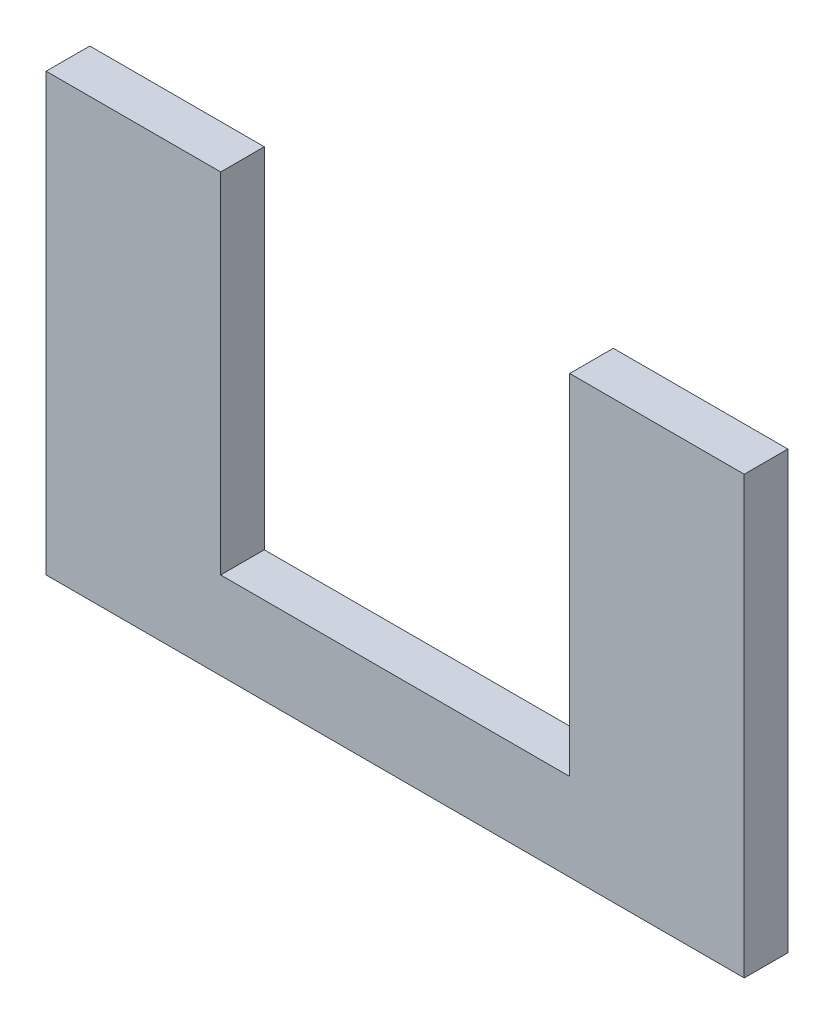
ISO-10303-21;
HEADER;
FILE_DESCRIPTION(('STEP AP214'),'2;1');
FILE_NAME('part.step','',(''),(''),'','','');
FILE_SCHEMA(('AUTOMOTIVE_DESIGN { 1 0 10303 214 1 1 1 1 }'));
ENDSEC;
DATA;
#1=APPLICATION_CONTEXT('core data for automotive mechanical design processes');
#2=APPLICATION_PROTOCOL_DEFINITION('international standard','automotive_design',2000,#1);
#3=PRODUCT_CONTEXT('',#1,'mechanical');
#4=PRODUCT('Part','Part','',(#3));
#5=PRODUCT_RELATED_PRODUCT_CATEGORY('part','',(#4));
#6=PRODUCT_DEFINITION_FORMATION('','',#4);
#7=PRODUCT_DEFINITION_CONTEXT('part definition',#1,'design');
#8=PRODUCT_DEFINITION('design','',#6,#7);
#9=PRODUCT_DEFINITION_SHAPE('','',#8);
#10=(LENGTH_UNIT() NAMED_UNIT(*) SI_UNIT(.MILLI.,.METRE.));
#11=(NAMED_UNIT(*) PLANE_ANGLE_UNIT() SI_UNIT($,.RADIAN.));
#12=(NAMED_UNIT(*) SI_UNIT($,.STERADIAN.) SOLID_ANGLE_UNIT());
#13=UNCERTAINTY_MEASURE_WITH_UNIT(LENGTH_MEASURE(1.E-05),#10,'distance_accuracy_value','');
#14=(GEOMETRIC_REPRESENTATION_CONTEXT(3) GLOBAL_UNCERTAINTY_ASSIGNED_CONTEXT((#13)) GLOBAL_UNIT_ASSIGNED_CONTEXT((#10,
#11,#12)) REPRESENTATION_CONTEXT('',''));
#15=CARTESIAN_POINT('',(0.,0.,0.));
#16=DIRECTION('',(0.,0.,1.));
#17=DIRECTION('',(1.,0.,0.));
#18=AXIS2_PLACEMENT_3D('',#15,#16,#17);
#19=CARTESIAN_POINT('',(0.,50.,0.));
#20=DIRECTION('',(0.,1.,0.));
#21=DIRECTION('',(0.,0.,1.));
#22=AXIS2_PLACEMENT_3D('',#19,#20,#21);
#23=PLANE('',#22);
#24=DIRECTION('',(0.,0.,1.));
#25=VECTOR('',#24,1.);
#26=CARTESIAN_POINT('',(-20.,50.,0.));
#27=LINE('',#26,#25);
#28=CARTESIAN_POINT('',(-20.,50.,-2.5));
#29=VERTEX_POINT('',#28);
#30=CARTESIAN_POINT('',(-20.,50.,2.5));
#31=VERTEX_POINT('',#30);
#32=EDGE_CURVE('E11',#29,#31,#27,.T.);
#33=ORIENTED_EDGE('',*,*,#32,.F.);
#34=DIRECTION('',(-1.,0.,0.));
#35=VECTOR('',#34,1.);
#36=CARTESIAN_POINT('',(0.,50.,-2.5));
#37=LINE('',#36,#35);
#38=CARTESIAN_POINT('',(-40.,50.,-2.5));
#39=VERTEX_POINT('',#38);
#40=EDGE_CURVE('E137',#29,#39,#37,.T.);
#41=ORIENTED_EDGE('',*,*,#40,.T.);
#42=DIRECTION('',(0.,0.,1.));
#43=VECTOR('',#42,1.);
#44=CARTESIAN_POINT('',(-40.,50.,0.));
#45=LINE('',#44,#43);
#46=CARTESIAN_POINT('',(-40.,50.,2.5));
#47=VERTEX_POINT('',#46);
#48=EDGE_CURVE('E139',#39,#47,#45,.T.);
#49=ORIENTED_EDGE('',*,*,#48,.T.);
#50=DIRECTION('',(1.,0.,0.));
#51=VECTOR('',#50,1.);
#52=CARTESIAN_POINT('',(0.,50.,2.5));
#53=LINE('',#52,#51);
#54=EDGE_CURVE('E141',#47,#31,#53,.T.);
#55=ORIENTED_EDGE('',*,*,#54,.T.);
#56=EDGE_LOOP('',(#33,#41,#49,#55));
#57=FACE_BOUND('',#56,.T.);
#58=ADVANCED_FACE('F34',(#57),#23,.T.);
#59=CARTESIAN_POINT('',(40.,50.,0.));
#60=DIRECTION('',(-1.,0.,0.));
#61=DIRECTION('',(0.,0.,1.));
#62=AXIS2_PLACEMENT_3D('',#59,#60,#61);
#63=PLANE('',#62);
#64=DIRECTION('',(0.,0.,-1.));
#65=VECTOR('',#64,1.);
#66=CARTESIAN_POINT('',(40.,0.,0.));
#67=LINE('',#66,#65);
#68=CARTESIAN_POINT('',(40.,0.,2.5));
#69=VERTEX_POINT('',#68);
#70=CARTESIAN_POINT('',(40.,0.,-2.5));
#71=VERTEX_POINT('',#70);
#72=EDGE_CURVE('E134',#69,#71,#67,.T.);
#73=ORIENTED_EDGE('',*,*,#72,.T.);
#74=DIRECTION('',(0.,-1.,0.));
#75=VECTOR('',#74,1.);
#76=CARTESIAN_POINT('',(40.,50.,-2.5));
#77=LINE('',#76,#75);
#78=CARTESIAN_POINT('',(40.,50.,-2.5));
#79=VERTEX_POINT('',#78);
#80=EDGE_CURVE('E158',#79,#71,#77,.T.);
#81=ORIENTED_EDGE('',*,*,#80,.F.);
#82=DIRECTION('',(0.,0.,-1.));
#83=VECTOR('',#82,1.);
#84=CARTESIAN_POINT('',(40.,50.,0.));
#85=LINE('',#84,#83);
#86=CARTESIAN_POINT('',(40.,50.,2.5));
#87=VERTEX_POINT('',#86);
#88=EDGE_CURVE('E135',#87,#79,#85,.T.);
#89=ORIENTED_EDGE('',*,*,#88,.F.);
#90=DIRECTION('',(0.,-1.,0.));
#91=VECTOR('',#90,1.);
#92=CARTESIAN_POINT('',(40.,50.,2.5));
#93=LINE('',#92,#91);
#94=EDGE_CURVE('E144',#87,#69,#93,.T.);
#95=ORIENTED_EDGE('',*,*,#94,.T.);
#96=EDGE_LOOP('',(#73,#81,#89,#95));
#97=FACE_BOUND('',#96,.T.);
#98=ADVANCED_FACE('F36',(#97),#63,.F.);
#99=CARTESIAN_POINT('',(0.,50.,-2.5));
#100=DIRECTION('',(0.,0.,1.));
#101=DIRECTION('',(1.,0.,0.));
#102=AXIS2_PLACEMENT_3D('',#99,#100,#101);
#103=PLANE('',#102);
#104=ORIENTED_EDGE('',*,*,#40,.F.);
#105=DIRECTION('',(0.,-1.,0.));
#106=VECTOR('',#105,1.);
#107=CARTESIAN_POINT('',(-20.,50.,-2.5));
#108=LINE('',#107,#106);
#109=CARTESIAN_POINT('',(-20.,10.,-2.5));
#110=VERTEX_POINT('',#109);
#111=EDGE_CURVE('E129',#29,#110,#108,.T.);
#112=ORIENTED_EDGE('',*,*,#111,.T.);
#113=DIRECTION('',(1.,0.,0.));
#114=VECTOR('',#113,1.);
#115=CARTESIAN_POINT('',(0.,10.,-2.5));
#116=LINE('',#115,#114);
#117=CARTESIAN_POINT('',(20.,10.,-2.5));
#118=VERTEX_POINT('',#117);
#119=EDGE_CURVE('E132',#110,#118,#116,.T.);
#120=ORIENTED_EDGE('',*,*,#119,.T.);
#121=DIRECTION('',(0.,1.,0.));
#122=VECTOR('',#121,1.);
#123=CARTESIAN_POINT('',(20.,50.,-2.5));
#124=LINE('',#123,#122);
#125=CARTESIAN_POINT('',(20.,50.,-2.5));
#126=VERTEX_POINT('',#125);
#127=EDGE_CURVE('E110',#118,#126,#124,.T.);
#128=ORIENTED_EDGE('',*,*,#127,.T.);
#129=EDGE_CURVE('E87',#79,#126,#37,.T.);
#130=ORIENTED_EDGE('',*,*,#129,.F.);
#131=ORIENTED_EDGE('',*,*,#80,.T.);
#132=DIRECTION('',(-1.,0.,0.));
#133=VECTOR('',#132,1.);
#134=CARTESIAN_POINT('',(0.,0.,-2.5));
#135=LINE('',#134,#133);
#136=CARTESIAN_POINT('',(-40.,0.,-2.5));
#137=VERTEX_POINT('',#136);
#138=EDGE_CURVE('E147',#71,#137,#135,.T.);
#139=ORIENTED_EDGE('',*,*,#138,.T.);
#140=DIRECTION('',(0.,-1.,0.));
#141=VECTOR('',#140,1.);
#142=CARTESIAN_POINT('',(-40.,50.,-2.5));
#143=LINE('',#142,#141);
#144=EDGE_CURVE('E155',#39,#137,#143,.T.);
#145=ORIENTED_EDGE('',*,*,#144,.F.);
#146=EDGE_LOOP('',(#104,#112,#120,#128,#130,#131,#139,#145));
#147=FACE_BOUND('',#146,.T.);
#148=ADVANCED_FACE('F160',(#147),#103,.F.);
#149=CARTESIAN_POINT('',(-40.,50.,0.));
#150=DIRECTION('',(1.,0.,0.));
#151=DIRECTION('',(0.,0.,-1.));
#152=AXIS2_PLACEMENT_3D('',#149,#150,#151);
#153=PLANE('',#152);
#154=DIRECTION('',(0.,0.,1.));
#155=VECTOR('',#154,1.);
#156=CARTESIAN_POINT('',(-40.,0.,0.));
#157=LINE('',#156,#155);
#158=CARTESIAN_POINT('',(-40.,0.,2.5));
#159=VERTEX_POINT('',#158);
#160=EDGE_CURVE('E149',#137,#159,#157,.T.);
#161=ORIENTED_EDGE('',*,*,#160,.T.);
#162=DIRECTION('',(0.,-1.,0.));
#163=VECTOR('',#162,1.);
#164=CARTESIAN_POINT('',(-40.,50.,2.5));
#165=LINE('',#164,#163);
#166=EDGE_CURVE('E153',#47,#159,#165,.T.);
#167=ORIENTED_EDGE('',*,*,#166,.F.);
#168=ORIENTED_EDGE('',*,*,#48,.F.);
#169=ORIENTED_EDGE('',*,*,#144,.T.);
#170=EDGE_LOOP('',(#161,#167,#168,#169));
#171=FACE_BOUND('',#170,.T.);
#172=ADVANCED_FACE('F171',(#171),#153,.F.);
#173=CARTESIAN_POINT('',(0.,50.,2.5));
#174=DIRECTION('',(0.,0.,-1.));
#175=DIRECTION('',(-1.,0.,0.));
#176=AXIS2_PLACEMENT_3D('',#173,#174,#175);
#177=PLANE('',#176);
#178=DIRECTION('',(1.,0.,0.));
#179=VECTOR('',#178,1.);
#180=CARTESIAN_POINT('',(0.,10.,2.5));
#181=LINE('',#180,#179);
#182=CARTESIAN_POINT('',(-20.,10.,2.5));
#183=VERTEX_POINT('',#182);
#184=CARTESIAN_POINT('',(20.,10.,2.5));
#185=VERTEX_POINT('',#184);
#186=EDGE_CURVE('E117',#183,#185,#181,.T.);
#187=ORIENTED_EDGE('',*,*,#186,.F.);
#188=DIRECTION('',(0.,-1.,0.));
#189=VECTOR('',#188,1.);
#190=CARTESIAN_POINT('',(-20.,0.,2.5));
#191=LINE('',#190,#189);
#192=EDGE_CURVE('E114',#31,#183,#191,.T.);
#193=ORIENTED_EDGE('',*,*,#192,.F.);
#194=ORIENTED_EDGE('',*,*,#54,.F.);
#195=ORIENTED_EDGE('',*,*,#166,.T.);
#196=DIRECTION('',(1.,0.,0.));
#197=VECTOR('',#196,1.);
#198=CARTESIAN_POINT('',(0.,0.,2.5));
#199=LINE('',#198,#197);
#200=EDGE_CURVE('E79',#159,#69,#199,.T.);
#201=ORIENTED_EDGE('',*,*,#200,.T.);
#202=ORIENTED_EDGE('',*,*,#94,.F.);
#203=CARTESIAN_POINT('',(20.,50.,2.5));
#204=VERTEX_POINT('',#203);
#205=EDGE_CURVE('E57',#204,#87,#53,.T.);
#206=ORIENTED_EDGE('',*,*,#205,.F.);
#207=DIRECTION('',(0.,1.,0.));
#208=VECTOR('',#207,1.);
#209=CARTESIAN_POINT('',(20.,0.,2.5));
#210=LINE('',#209,#208);
#211=EDGE_CURVE('E49',#185,#204,#210,.T.);
#212=ORIENTED_EDGE('',*,*,#211,.F.);
#213=EDGE_LOOP('',(#187,#193,#194,#195,#201,#202,#206,#212));
#214=FACE_BOUND('',#213,.T.);
#215=ADVANCED_FACE('F123',(#214),#177,.F.);
#216=DIRECTION('',(0.,0.,-1.));
#217=VECTOR('',#216,1.);
#218=CARTESIAN_POINT('',(20.,50.,0.));
#219=LINE('',#218,#217);
#220=EDGE_CURVE('E42',#204,#126,#219,.T.);
#221=ORIENTED_EDGE('',*,*,#220,.F.);
#222=ORIENTED_EDGE('',*,*,#205,.T.);
#223=ORIENTED_EDGE('',*,*,#88,.T.);
#224=ORIENTED_EDGE('',*,*,#129,.T.);
#225=EDGE_LOOP('',(#221,#222,#223,#224));
#226=FACE_BOUND('',#225,.T.);
#227=ADVANCED_FACE('F161',(#226),#23,.T.);
#228=CARTESIAN_POINT('',(0.,0.,0.));
#229=DIRECTION('',(0.,1.,0.));
#230=DIRECTION('',(0.,0.,1.));
#231=AXIS2_PLACEMENT_3D('',#228,#229,#230);
#232=PLANE('',#231);
#233=ORIENTED_EDGE('',*,*,#72,.F.);
#234=ORIENTED_EDGE('',*,*,#200,.F.);
#235=ORIENTED_EDGE('',*,*,#160,.F.);
#236=ORIENTED_EDGE('',*,*,#138,.F.);
#237=EDGE_LOOP('',(#233,#234,#235,#236));
#238=FACE_BOUND('',#237,.T.);
#239=ADVANCED_FACE('F173',(#238),#232,.F.);
#240=CARTESIAN_POINT('',(0.,10.,-47.5));
#241=DIRECTION('',(0.,-1.,0.));
#242=DIRECTION('',(0.,0.,-1.));
#243=AXIS2_PLACEMENT_3D('',#240,#241,#242);
#244=PLANE('',#243);
#245=DIRECTION('',(0.,0.,1.));
#246=VECTOR('',#245,1.);
#247=CARTESIAN_POINT('',(-20.,10.,-47.5));
#248=LINE('',#247,#246);
#249=EDGE_CURVE('E113',#110,#183,#248,.T.);
#250=ORIENTED_EDGE('',*,*,#249,.T.);
#251=ORIENTED_EDGE('',*,*,#186,.T.);
#252=DIRECTION('',(0.,0.,1.));
#253=VECTOR('',#252,1.);
#254=CARTESIAN_POINT('',(20.,10.,-47.5));
#255=LINE('',#254,#253);
#256=EDGE_CURVE('E107',#118,#185,#255,.T.);
#257=ORIENTED_EDGE('',*,*,#256,.F.);
#258=ORIENTED_EDGE('',*,*,#119,.F.);
#259=EDGE_LOOP('',(#250,#251,#257,#258));
#260=FACE_BOUND('',#259,.T.);
#261=ADVANCED_FACE('F118',(#260),#244,.F.);
#262=CARTESIAN_POINT('',(-20.,0.,-47.5));
#263=DIRECTION('',(-1.,0.,0.));
#264=DIRECTION('',(0.,-1.,0.));
#265=AXIS2_PLACEMENT_3D('',#262,#263,#264);
#266=PLANE('',#265);
#267=ORIENTED_EDGE('',*,*,#32,.T.);
#268=ORIENTED_EDGE('',*,*,#192,.T.);
#269=ORIENTED_EDGE('',*,*,#249,.F.);
#270=ORIENTED_EDGE('',*,*,#111,.F.);
#271=EDGE_LOOP('',(#267,#268,#269,#270));
#272=FACE_BOUND('',#271,.T.);
#273=ADVANCED_FACE('F180',(#272),#266,.F.);
#274=CARTESIAN_POINT('',(20.,0.,-47.5));
#275=DIRECTION('',(1.,0.,0.));
#276=DIRECTION('',(0.,1.,0.));
#277=AXIS2_PLACEMENT_3D('',#274,#275,#276);
#278=PLANE('',#277);
#279=ORIENTED_EDGE('',*,*,#256,.T.);
#280=ORIENTED_EDGE('',*,*,#211,.T.);
#281=ORIENTED_EDGE('',*,*,#220,.T.);
#282=ORIENTED_EDGE('',*,*,#127,.F.);
#283=EDGE_LOOP('',(#279,#280,#281,#282));
#284=FACE_BOUND('',#283,.T.);
#285=ADVANCED_FACE('F109',(#284),#278,.F.);
#286=CLOSED_SHELL('',(#58,#98,#148,#172,#215,#227,#239,#261,#273,#285));
#287=MANIFOLD_SOLID_BREP('B2',#286);
#288=ADVANCED_BREP_SHAPE_REPRESENTATION('',(#18,#287),#14);
#289=SHAPE_DEFINITION_REPRESENTATION(#9,#288);
ENDSEC;
END-ISO-10303-21;
